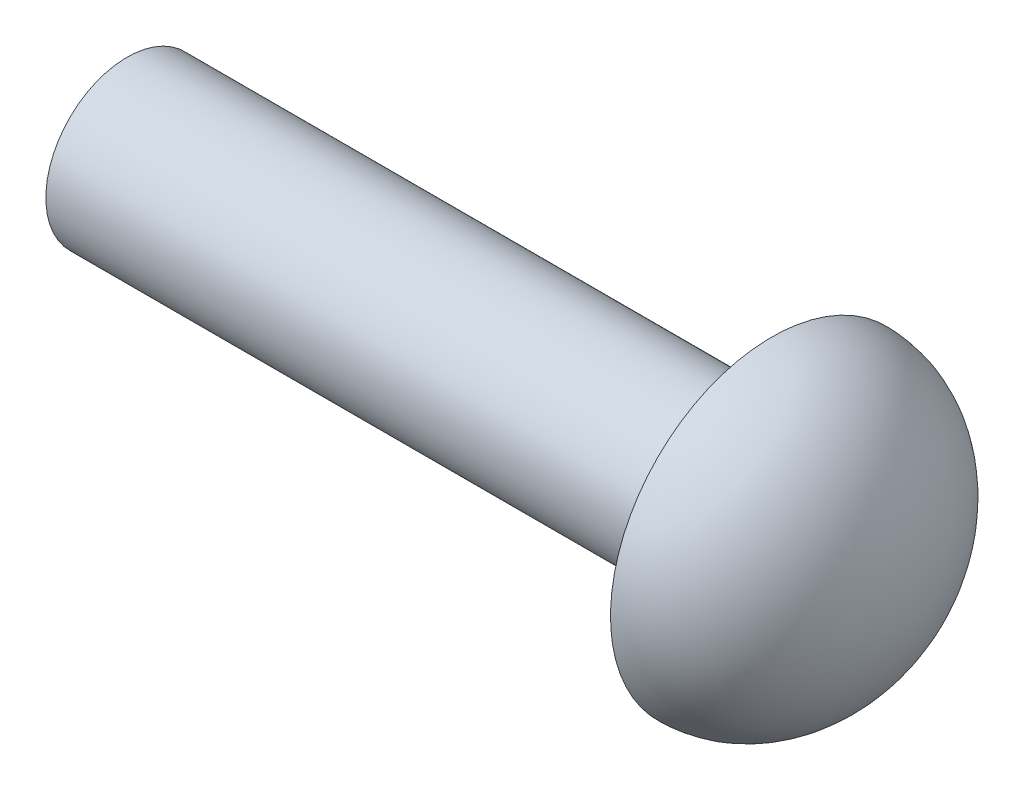
ISO-10303-21;
HEADER;
FILE_DESCRIPTION(('STEP AP214'),'2;1');
FILE_NAME('part.step','',(''),(''),'','','');
FILE_SCHEMA(('AUTOMOTIVE_DESIGN { 1 0 10303 214 1 1 1 1 }'));
ENDSEC;
DATA;
#1=APPLICATION_CONTEXT('core data for automotive mechanical design processes');
#2=APPLICATION_PROTOCOL_DEFINITION('international standard','automotive_design',2000,#1);
#3=PRODUCT_CONTEXT('',#1,'mechanical');
#4=PRODUCT('Part','Part','',(#3));
#5=PRODUCT_RELATED_PRODUCT_CATEGORY('part','',(#4));
#6=PRODUCT_DEFINITION_FORMATION('','',#4);
#7=PRODUCT_DEFINITION_CONTEXT('part definition',#1,'design');
#8=PRODUCT_DEFINITION('design','',#6,#7);
#9=PRODUCT_DEFINITION_SHAPE('','',#8);
#10=(LENGTH_UNIT() NAMED_UNIT(*) SI_UNIT(.MILLI.,.METRE.));
#11=(NAMED_UNIT(*) PLANE_ANGLE_UNIT() SI_UNIT($,.RADIAN.));
#12=(NAMED_UNIT(*) SI_UNIT($,.STERADIAN.) SOLID_ANGLE_UNIT());
#13=UNCERTAINTY_MEASURE_WITH_UNIT(LENGTH_MEASURE(1.E-05),#10,'distance_accuracy_value','');
#14=(GEOMETRIC_REPRESENTATION_CONTEXT(3) GLOBAL_UNCERTAINTY_ASSIGNED_CONTEXT((#13)) GLOBAL_UNIT_ASSIGNED_CONTEXT((#10,
#11,#12)) REPRESENTATION_CONTEXT('',''));
#15=CARTESIAN_POINT('',(0.,0.,0.));
#16=DIRECTION('',(0.,0.,1.));
#17=DIRECTION('',(1.,0.,0.));
#18=AXIS2_PLACEMENT_3D('',#15,#16,#17);
#19=CARTESIAN_POINT('',(0.,0.,0.));
#20=DIRECTION('',(1.,0.,0.));
#21=DIRECTION('',(0.,0.,-1.));
#22=AXIS2_PLACEMENT_3D('',#19,#20,#21);
#23=PLANE('',#22);
#24=CARTESIAN_POINT('',(0.,0.,0.));
#25=DIRECTION('',(1.,0.,0.));
#26=DIRECTION('',(0.,0.,-1.));
#27=AXIS2_PLACEMENT_3D('',#24,#25,#26);
#28=CIRCLE('',#27,1.2603305785124);
#29=CARTESIAN_POINT('',(0.,0.,-1.2603305785124));
#30=VERTEX_POINT('',#29);
#31=EDGE_CURVE('E11',#30,#30,#28,.T.);
#32=ORIENTED_EDGE('',*,*,#31,.F.);
#33=EDGE_LOOP('',(#32));
#34=FACE_BOUND('',#33,.T.);
#35=ADVANCED_FACE('F33',(#34),#23,.F.);
#36=CARTESIAN_POINT('',(12.,0.,0.));
#37=DIRECTION('',(1.,0.,0.));
#38=DIRECTION('',(0.,0.,-1.));
#39=AXIS2_PLACEMENT_3D('',#36,#37,#38);
#40=CYLINDRICAL_SURFACE('',#39,1.2603305785124);
#41=CARTESIAN_POINT('',(10.,0.,0.));
#42=DIRECTION('',(1.,0.,0.));
#43=DIRECTION('',(0.,0.,-1.));
#44=AXIS2_PLACEMENT_3D('',#41,#42,#43);
#45=CIRCLE('',#44,1.2603305785124);
#46=CARTESIAN_POINT('',(10.,0.,-1.2603305785124));
#47=VERTEX_POINT('',#46);
#48=EDGE_CURVE('E39',#47,#47,#45,.T.);
#49=ORIENTED_EDGE('',*,*,#48,.F.);
#50=EDGE_LOOP('',(#49));
#51=FACE_BOUND('',#50,.T.);
#52=ORIENTED_EDGE('',*,*,#31,.T.);
#53=EDGE_LOOP('',(#52));
#54=FACE_BOUND('',#53,.T.);
#55=ADVANCED_FACE('F57',(#51,#54),#40,.T.);
#56=CARTESIAN_POINT('',(10.,-1.2603305785124,0.));
#57=DIRECTION('',(1.,0.,0.));
#58=DIRECTION('',(0.,0.,-1.));
#59=AXIS2_PLACEMENT_3D('',#56,#57,#58);
#60=PLANE('',#59);
#61=CARTESIAN_POINT('',(10.,0.,0.));
#62=DIRECTION('',(1.,0.,0.));
#63=DIRECTION('',(0.,0.,-1.));
#64=AXIS2_PLACEMENT_3D('',#61,#62,#63);
#65=CIRCLE('',#64,2.5);
#66=CARTESIAN_POINT('',(10.,0.,-2.5));
#67=VERTEX_POINT('',#66);
#68=EDGE_CURVE('E49',#67,#67,#65,.T.);
#69=ORIENTED_EDGE('',*,*,#68,.F.);
#70=EDGE_LOOP('',(#69));
#71=FACE_BOUND('',#70,.T.);
#72=ORIENTED_EDGE('',*,*,#48,.T.);
#73=EDGE_LOOP('',(#72));
#74=FACE_BOUND('',#73,.T.);
#75=ADVANCED_FACE('F45',(#71,#74),#60,.F.);
#76=CARTESIAN_POINT('',(10.,0.,0.));
#77=DIRECTION('',(0.,0.,1.));
#78=DIRECTION('',(0.,1.,0.));
#79=AXIS2_PLACEMENT_3D('',#76,#77,#78);
#80=ELLIPSE('',#79,2.5,2.);
#81=TRIMMED_CURVE('',#80,(PARAMETER_VALUE(1.5707963267949)),(PARAMETER_VALUE(4.71238898038469)),
.T.,.PARAMETER.);
#82=CARTESIAN_POINT('',(12.,0.,0.));
#83=DIRECTION('',(1.,0.,0.));
#84=AXIS1_PLACEMENT('',#82,#83);
#85=SURFACE_OF_REVOLUTION('',#81,#84);
#86=CARTESIAN_POINT('',(12.,0.,0.));
#87=VERTEX_POINT('',#86);
#88=VERTEX_LOOP('',#87);
#89=FACE_BOUND('',#88,.T.);
#90=ORIENTED_EDGE('',*,*,#68,.T.);
#91=EDGE_LOOP('',(#90));
#92=FACE_BOUND('',#91,.T.);
#93=ADVANCED_FACE('F42',(#89,#92),#85,.T.);
#94=CLOSED_SHELL('',(#35,#55,#75,#93));
#95=MANIFOLD_SOLID_BREP('B2',#94);
#96=ADVANCED_BREP_SHAPE_REPRESENTATION('',(#18,#95),#14);
#97=SHAPE_DEFINITION_REPRESENTATION(#9,#96);
ENDSEC;
END-ISO-10303-21;
